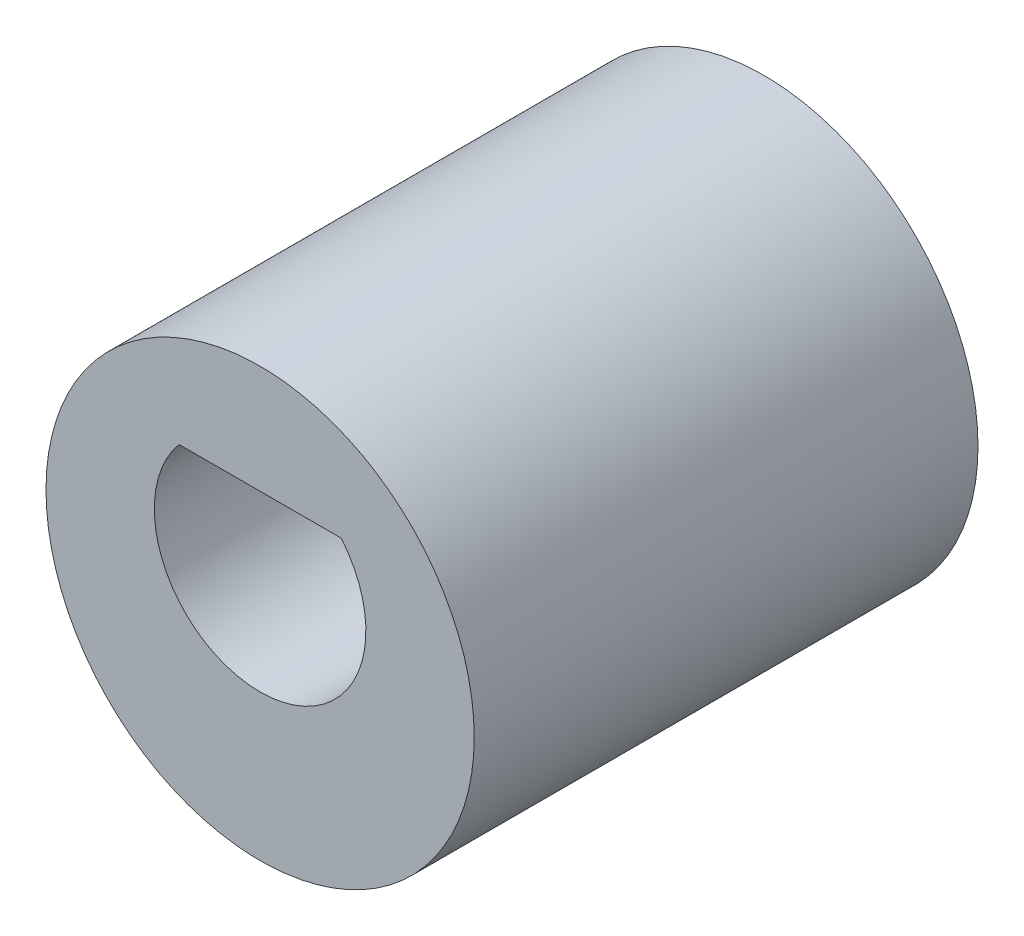
ISO-10303-21;
HEADER;
FILE_DESCRIPTION(('STEP AP214'),'2;1');
FILE_NAME('part.step','',(''),(''),'','','');
FILE_SCHEMA(('AUTOMOTIVE_DESIGN { 1 0 10303 214 1 1 1 1 }'));
ENDSEC;
DATA;
#1=APPLICATION_CONTEXT('core data for automotive mechanical design processes');
#2=APPLICATION_PROTOCOL_DEFINITION('international standard','automotive_design',2000,#1);
#3=PRODUCT_CONTEXT('',#1,'mechanical');
#4=PRODUCT('Part','Part','',(#3));
#5=PRODUCT_RELATED_PRODUCT_CATEGORY('part','',(#4));
#6=PRODUCT_DEFINITION_FORMATION('','',#4);
#7=PRODUCT_DEFINITION_CONTEXT('part definition',#1,'design');
#8=PRODUCT_DEFINITION('design','',#6,#7);
#9=PRODUCT_DEFINITION_SHAPE('','',#8);
#10=(LENGTH_UNIT() NAMED_UNIT(*) SI_UNIT(.MILLI.,.METRE.));
#11=(NAMED_UNIT(*) PLANE_ANGLE_UNIT() SI_UNIT($,.RADIAN.));
#12=(NAMED_UNIT(*) SI_UNIT($,.STERADIAN.) SOLID_ANGLE_UNIT());
#13=UNCERTAINTY_MEASURE_WITH_UNIT(LENGTH_MEASURE(1.E-05),#10,'distance_accuracy_value','');
#14=(GEOMETRIC_REPRESENTATION_CONTEXT(3) GLOBAL_UNCERTAINTY_ASSIGNED_CONTEXT((#13)) GLOBAL_UNIT_ASSIGNED_CONTEXT((#10,
#11,#12)) REPRESENTATION_CONTEXT('',''));
#15=CARTESIAN_POINT('',(0.,0.,0.));
#16=DIRECTION('',(0.,0.,1.));
#17=DIRECTION('',(1.,0.,0.));
#18=AXIS2_PLACEMENT_3D('',#15,#16,#17);
#19=CARTESIAN_POINT('',(0.,1.5,20.));
#20=DIRECTION('',(0.,0.,-1.));
#21=DIRECTION('',(-1.,0.,0.));
#22=AXIS2_PLACEMENT_3D('',#19,#20,#21);
#23=CYLINDRICAL_SURFACE('',#22,0.5);
#24=CARTESIAN_POINT('',(0.,1.5,0.));
#25=DIRECTION('',(0.,0.,1.));
#26=DIRECTION('',(1.,0.,0.));
#27=AXIS2_PLACEMENT_3D('',#24,#25,#26);
#28=CIRCLE('',#27,0.5);
#29=CARTESIAN_POINT('',(0.5,1.5,0.));
#30=VERTEX_POINT('',#29);
#31=EDGE_CURVE('E92',#30,#30,#28,.T.);
#32=ORIENTED_EDGE('',*,*,#31,.F.);
#33=EDGE_LOOP('',(#32));
#34=FACE_BOUND('',#33,.T.);
#35=CARTESIAN_POINT('',(0.,1.5,8.));
#36=DIRECTION('',(0.,0.,1.));
#37=DIRECTION('',(1.,0.,0.));
#38=AXIS2_PLACEMENT_3D('',#35,#36,#37);
#39=CIRCLE('',#38,0.5);
#40=CARTESIAN_POINT('',(0.5,1.5,8.));
#41=VERTEX_POINT('',#40);
#42=EDGE_CURVE('E45',#41,#41,#39,.T.);
#43=ORIENTED_EDGE('',*,*,#42,.T.);
#44=EDGE_LOOP('',(#43));
#45=FACE_BOUND('',#44,.T.);
#46=ADVANCED_FACE('F41',(#34,#45),#23,.F.);
#47=CARTESIAN_POINT('',(0.,0.,0.));
#48=DIRECTION('',(0.,0.,1.));
#49=DIRECTION('',(1.,0.,0.));
#50=AXIS2_PLACEMENT_3D('',#47,#48,#49);
#51=PLANE('',#50);
#52=CARTESIAN_POINT('',(0.,0.,0.));
#53=DIRECTION('',(0.,0.,1.));
#54=DIRECTION('',(1.,0.,0.));
#55=AXIS2_PLACEMENT_3D('',#52,#53,#54);
#56=CIRCLE('',#55,8.5);
#57=CARTESIAN_POINT('',(8.5,0.,0.));
#58=VERTEX_POINT('',#57);
#59=EDGE_CURVE('E50',#58,#58,#56,.T.);
#60=ORIENTED_EDGE('',*,*,#59,.F.);
#61=EDGE_LOOP('',(#60));
#62=FACE_BOUND('',#61,.T.);
#63=ORIENTED_EDGE('',*,*,#31,.T.);
#64=EDGE_LOOP('',(#63));
#65=FACE_BOUND('',#64,.T.);
#66=CARTESIAN_POINT('',(-5.,1.5,0.));
#67=DIRECTION('',(0.,0.,1.));
#68=DIRECTION('',(1.,0.,0.));
#69=AXIS2_PLACEMENT_3D('',#66,#67,#68);
#70=CIRCLE('',#69,2.3);
#71=CARTESIAN_POINT('',(-2.7,1.5,0.));
#72=VERTEX_POINT('',#71);
#73=EDGE_CURVE('E89',#72,#72,#70,.T.);
#74=ORIENTED_EDGE('',*,*,#73,.T.);
#75=EDGE_LOOP('',(#74));
#76=FACE_BOUND('',#75,.T.);
#77=CARTESIAN_POINT('',(5.,1.5,0.));
#78=DIRECTION('',(0.,0.,1.));
#79=DIRECTION('',(1.,0.,0.));
#80=AXIS2_PLACEMENT_3D('',#77,#78,#79);
#81=CIRCLE('',#80,2.3);
#82=CARTESIAN_POINT('',(7.3,1.5,0.));
#83=VERTEX_POINT('',#82);
#84=EDGE_CURVE('E96',#83,#83,#81,.T.);
#85=ORIENTED_EDGE('',*,*,#84,.T.);
#86=EDGE_LOOP('',(#85));
#87=FACE_BOUND('',#86,.T.);
#88=ADVANCED_FACE('F107',(#62,#65,#76,#87),#51,.F.);
#89=CARTESIAN_POINT('',(0.,0.,20.));
#90=DIRECTION('',(0.,0.,1.));
#91=DIRECTION('',(1.,0.,0.));
#92=AXIS2_PLACEMENT_3D('',#89,#90,#91);
#93=PLANE('',#92);
#94=CARTESIAN_POINT('',(0.,1.5,20.));
#95=DIRECTION('',(0.,0.,1.));
#96=DIRECTION('',(1.,0.,0.));
#97=AXIS2_PLACEMENT_3D('',#94,#95,#96);
#98=CIRCLE('',#97,4.2);
#99=CARTESIAN_POINT('',(-3.21714158842908,4.2,20.));
#100=VERTEX_POINT('',#99);
#101=CARTESIAN_POINT('',(3.21714158842908,4.2,20.));
#102=VERTEX_POINT('',#101);
#103=EDGE_CURVE('E58',#100,#102,#98,.T.);
#104=ORIENTED_EDGE('',*,*,#103,.F.);
#105=DIRECTION('',(-1.,0.,0.));
#106=VECTOR('',#105,1.);
#107=CARTESIAN_POINT('',(-3.21714158842908,4.2,20.));
#108=LINE('',#107,#106);
#109=EDGE_CURVE('E77',#102,#100,#108,.T.);
#110=ORIENTED_EDGE('',*,*,#109,.F.);
#111=EDGE_LOOP('',(#104,#110));
#112=FACE_BOUND('',#111,.T.);
#113=CARTESIAN_POINT('',(0.,0.,20.));
#114=DIRECTION('',(0.,0.,1.));
#115=DIRECTION('',(1.,0.,0.));
#116=AXIS2_PLACEMENT_3D('',#113,#114,#115);
#117=CIRCLE('',#116,8.5);
#118=CARTESIAN_POINT('',(8.5,0.,20.));
#119=VERTEX_POINT('',#118);
#120=EDGE_CURVE('E11',#119,#119,#117,.T.);
#121=ORIENTED_EDGE('',*,*,#120,.T.);
#122=EDGE_LOOP('',(#121));
#123=FACE_BOUND('',#122,.T.);
#124=ADVANCED_FACE('F81',(#112,#123),#93,.T.);
#125=CARTESIAN_POINT('',(0.,0.,20.));
#126=DIRECTION('',(0.,0.,-1.));
#127=DIRECTION('',(-1.,0.,0.));
#128=AXIS2_PLACEMENT_3D('',#125,#126,#127);
#129=CYLINDRICAL_SURFACE('',#128,8.5);
#130=ORIENTED_EDGE('',*,*,#120,.F.);
#131=EDGE_LOOP('',(#130));
#132=FACE_BOUND('',#131,.T.);
#133=ORIENTED_EDGE('',*,*,#59,.T.);
#134=EDGE_LOOP('',(#133));
#135=FACE_BOUND('',#134,.T.);
#136=ADVANCED_FACE('F43',(#132,#135),#129,.T.);
#137=CARTESIAN_POINT('',(-5.,1.5,6.));
#138=DIRECTION('',(0.,0.,-1.));
#139=DIRECTION('',(-1.,0.,0.));
#140=AXIS2_PLACEMENT_3D('',#137,#138,#139);
#141=CYLINDRICAL_SURFACE('',#140,2.3);
#142=CARTESIAN_POINT('',(-5.,1.5,6.));
#143=DIRECTION('',(0.,0.,1.));
#144=DIRECTION('',(1.,0.,0.));
#145=AXIS2_PLACEMENT_3D('',#142,#143,#144);
#146=CIRCLE('',#145,2.3);
#147=CARTESIAN_POINT('',(-2.7,1.5,6.));
#148=VERTEX_POINT('',#147);
#149=EDGE_CURVE('E93',#148,#148,#146,.T.);
#150=ORIENTED_EDGE('',*,*,#149,.T.);
#151=EDGE_LOOP('',(#150));
#152=FACE_BOUND('',#151,.T.);
#153=ORIENTED_EDGE('',*,*,#73,.F.);
#154=EDGE_LOOP('',(#153));
#155=FACE_BOUND('',#154,.T.);
#156=ADVANCED_FACE('F128',(#152,#155),#141,.F.);
#157=CARTESIAN_POINT('',(-5.,1.5,6.));
#158=DIRECTION('',(0.,0.,1.));
#159=DIRECTION('',(1.,0.,0.));
#160=AXIS2_PLACEMENT_3D('',#157,#158,#159);
#161=PLANE('',#160);
#162=ORIENTED_EDGE('',*,*,#149,.F.);
#163=EDGE_LOOP('',(#162));
#164=FACE_BOUND('',#163,.T.);
#165=ADVANCED_FACE('F119',(#164),#161,.F.);
#166=CARTESIAN_POINT('',(5.,1.5,6.));
#167=DIRECTION('',(0.,0.,-1.));
#168=DIRECTION('',(-1.,0.,0.));
#169=AXIS2_PLACEMENT_3D('',#166,#167,#168);
#170=CYLINDRICAL_SURFACE('',#169,2.3);
#171=CARTESIAN_POINT('',(5.,1.5,6.));
#172=DIRECTION('',(0.,0.,1.));
#173=DIRECTION('',(1.,0.,0.));
#174=AXIS2_PLACEMENT_3D('',#171,#172,#173);
#175=CIRCLE('',#174,2.3);
#176=CARTESIAN_POINT('',(7.3,1.5,6.));
#177=VERTEX_POINT('',#176);
#178=EDGE_CURVE('E99',#177,#177,#175,.T.);
#179=ORIENTED_EDGE('',*,*,#178,.T.);
#180=EDGE_LOOP('',(#179));
#181=FACE_BOUND('',#180,.T.);
#182=ORIENTED_EDGE('',*,*,#84,.F.);
#183=EDGE_LOOP('',(#182));
#184=FACE_BOUND('',#183,.T.);
#185=ADVANCED_FACE('F116',(#181,#184),#170,.F.);
#186=CARTESIAN_POINT('',(5.,1.5,6.));
#187=DIRECTION('',(0.,0.,1.));
#188=DIRECTION('',(1.,0.,0.));
#189=AXIS2_PLACEMENT_3D('',#186,#187,#188);
#190=PLANE('',#189);
#191=ORIENTED_EDGE('',*,*,#178,.F.);
#192=EDGE_LOOP('',(#191));
#193=FACE_BOUND('',#192,.T.);
#194=ADVANCED_FACE('F118',(#193),#190,.F.);
#195=CARTESIAN_POINT('',(0.,1.5,8.));
#196=DIRECTION('',(0.,0.,1.));
#197=DIRECTION('',(1.,0.,0.));
#198=AXIS2_PLACEMENT_3D('',#195,#196,#197);
#199=CYLINDRICAL_SURFACE('',#198,4.2);
#200=ORIENTED_EDGE('',*,*,#103,.T.);
#201=DIRECTION('',(0.,0.,1.));
#202=VECTOR('',#201,1.);
#203=CARTESIAN_POINT('',(3.21714158842908,4.2,8.));
#204=LINE('',#203,#202);
#205=CARTESIAN_POINT('',(3.21714158842908,4.2,8.));
#206=VERTEX_POINT('',#205);
#207=EDGE_CURVE('E74',#206,#102,#204,.T.);
#208=ORIENTED_EDGE('',*,*,#207,.F.);
#209=CARTESIAN_POINT('',(0.,1.5,8.));
#210=DIRECTION('',(0.,0.,1.));
#211=DIRECTION('',(1.,0.,0.));
#212=AXIS2_PLACEMENT_3D('',#209,#210,#211);
#213=CIRCLE('',#212,4.2);
#214=CARTESIAN_POINT('',(-3.21714158842908,4.2,8.));
#215=VERTEX_POINT('',#214);
#216=EDGE_CURVE('E72',#215,#206,#213,.T.);
#217=ORIENTED_EDGE('',*,*,#216,.F.);
#218=DIRECTION('',(0.,0.,1.));
#219=VECTOR('',#218,1.);
#220=CARTESIAN_POINT('',(-3.21714158842908,4.2,8.));
#221=LINE('',#220,#219);
#222=EDGE_CURVE('E66',#215,#100,#221,.T.);
#223=ORIENTED_EDGE('',*,*,#222,.T.);
#224=EDGE_LOOP('',(#200,#208,#217,#223));
#225=FACE_BOUND('',#224,.T.);
#226=ADVANCED_FACE('F70',(#225),#199,.F.);
#227=CARTESIAN_POINT('',(-3.21714158842908,4.2,8.));
#228=DIRECTION('',(0.,1.,0.));
#229=DIRECTION('',(0.,0.,1.));
#230=AXIS2_PLACEMENT_3D('',#227,#228,#229);
#231=PLANE('',#230);
#232=ORIENTED_EDGE('',*,*,#109,.T.);
#233=ORIENTED_EDGE('',*,*,#222,.F.);
#234=DIRECTION('',(-1.,0.,0.));
#235=VECTOR('',#234,1.);
#236=CARTESIAN_POINT('',(-3.21714158842908,4.2,8.));
#237=LINE('',#236,#235);
#238=EDGE_CURVE('E85',#206,#215,#237,.T.);
#239=ORIENTED_EDGE('',*,*,#238,.F.);
#240=ORIENTED_EDGE('',*,*,#207,.T.);
#241=EDGE_LOOP('',(#232,#233,#239,#240));
#242=FACE_BOUND('',#241,.T.);
#243=ADVANCED_FACE('F78',(#242),#231,.F.);
#244=CARTESIAN_POINT('',(0.,1.5,8.));
#245=DIRECTION('',(0.,0.,1.));
#246=DIRECTION('',(1.,0.,0.));
#247=AXIS2_PLACEMENT_3D('',#244,#245,#246);
#248=PLANE('',#247);
#249=ORIENTED_EDGE('',*,*,#42,.F.);
#250=EDGE_LOOP('',(#249));
#251=FACE_BOUND('',#250,.T.);
#252=ORIENTED_EDGE('',*,*,#216,.T.);
#253=ORIENTED_EDGE('',*,*,#238,.T.);
#254=EDGE_LOOP('',(#252,#253));
#255=FACE_BOUND('',#254,.T.);
#256=ADVANCED_FACE('F157',(#251,#255),#248,.T.);
#257=CLOSED_SHELL('',(#46,#88,#124,#136,#156,#165,#185,#194,#226,#243,#256));
#258=MANIFOLD_SOLID_BREP('B2',#257);
#259=ADVANCED_BREP_SHAPE_REPRESENTATION('',(#18,#258),#14);
#260=SHAPE_DEFINITION_REPRESENTATION(#9,#259);
ENDSEC;
END-ISO-10303-21;
